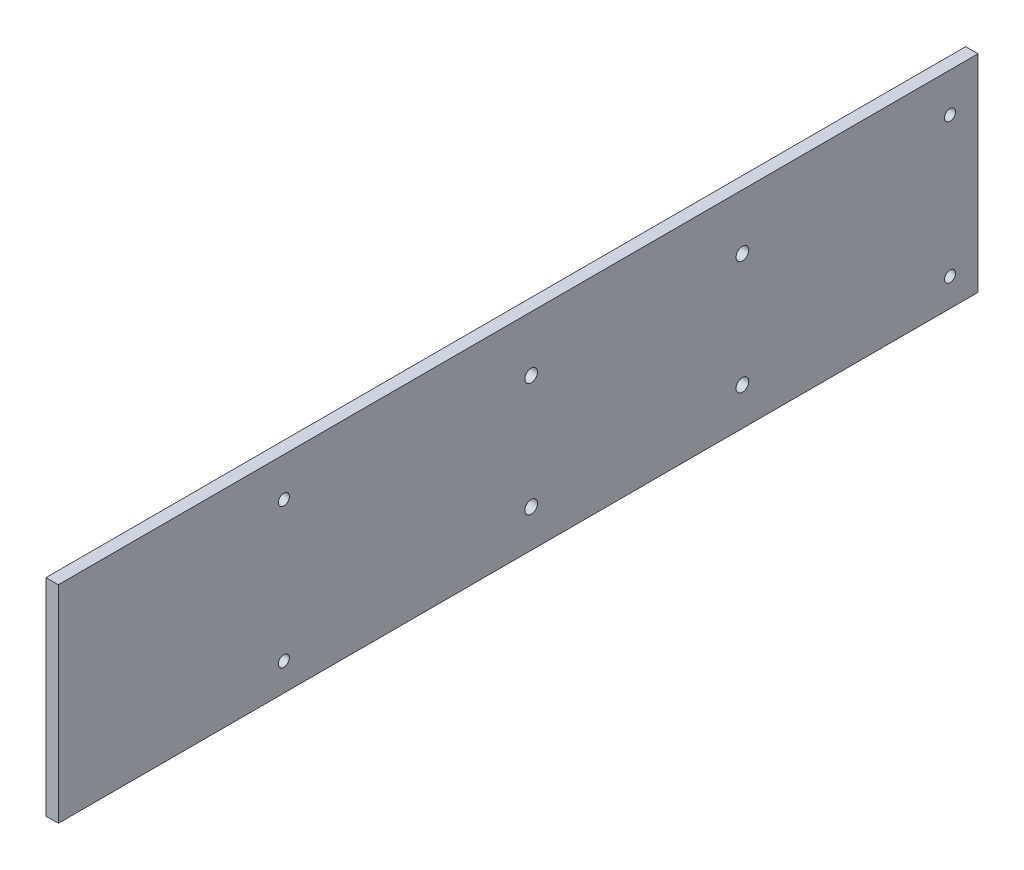
ISO-10303-21;
HEADER;
FILE_DESCRIPTION(('STEP AP214'),'2;1');
FILE_NAME('part.step','',(''),(''),'','','');
FILE_SCHEMA(('AUTOMOTIVE_DESIGN { 1 0 10303 214 1 1 1 1 }'));
ENDSEC;
DATA;
#1=APPLICATION_CONTEXT('core data for automotive mechanical design processes');
#2=APPLICATION_PROTOCOL_DEFINITION('international standard','automotive_design',2000,#1);
#3=PRODUCT_CONTEXT('',#1,'mechanical');
#4=PRODUCT('Part','Part','',(#3));
#5=PRODUCT_RELATED_PRODUCT_CATEGORY('part','',(#4));
#6=PRODUCT_DEFINITION_FORMATION('','',#4);
#7=PRODUCT_DEFINITION_CONTEXT('part definition',#1,'design');
#8=PRODUCT_DEFINITION('design','',#6,#7);
#9=PRODUCT_DEFINITION_SHAPE('','',#8);
#10=(LENGTH_UNIT() NAMED_UNIT(*) SI_UNIT(.MILLI.,.METRE.));
#11=(NAMED_UNIT(*) PLANE_ANGLE_UNIT() SI_UNIT($,.RADIAN.));
#12=(NAMED_UNIT(*) SI_UNIT($,.STERADIAN.) SOLID_ANGLE_UNIT());
#13=UNCERTAINTY_MEASURE_WITH_UNIT(LENGTH_MEASURE(1.E-05),#10,'distance_accuracy_value','');
#14=(GEOMETRIC_REPRESENTATION_CONTEXT(3) GLOBAL_UNCERTAINTY_ASSIGNED_CONTEXT((#13)) GLOBAL_UNIT_ASSIGNED_CONTEXT((#10,
#11,#12)) REPRESENTATION_CONTEXT('',''));
#15=CARTESIAN_POINT('',(0.,0.,0.));
#16=DIRECTION('',(0.,0.,1.));
#17=DIRECTION('',(1.,0.,0.));
#18=AXIS2_PLACEMENT_3D('',#15,#16,#17);
#19=CARTESIAN_POINT('',(4.826,38.1,-179.705));
#20=DIRECTION('',(0.,0.,1.));
#21=DIRECTION('',(1.,0.,0.));
#22=AXIS2_PLACEMENT_3D('',#19,#20,#21);
#23=PLANE('',#22);
#24=DIRECTION('',(0.,1.,0.));
#25=VECTOR('',#24,1.);
#26=CARTESIAN_POINT('',(0.,38.1,-179.705));
#27=LINE('',#26,#25);
#28=CARTESIAN_POINT('',(0.,-42.672,-179.705));
#29=VERTEX_POINT('',#28);
#30=CARTESIAN_POINT('',(0.,38.1,-179.705));
#31=VERTEX_POINT('',#30);
#32=EDGE_CURVE('E148',#29,#31,#27,.T.);
#33=ORIENTED_EDGE('',*,*,#32,.T.);
#34=DIRECTION('',(-1.,0.,0.));
#35=VECTOR('',#34,1.);
#36=CARTESIAN_POINT('',(4.826,38.1,-179.705));
#37=LINE('',#36,#35);
#38=CARTESIAN_POINT('',(4.826,38.1,-179.705));
#39=VERTEX_POINT('',#38);
#40=EDGE_CURVE('E11',#39,#31,#37,.T.);
#41=ORIENTED_EDGE('',*,*,#40,.F.);
#42=DIRECTION('',(0.,1.,0.));
#43=VECTOR('',#42,1.);
#44=CARTESIAN_POINT('',(4.826,38.1,-179.705));
#45=LINE('',#44,#43);
#46=CARTESIAN_POINT('',(4.82600000000004,-42.672,-179.705));
#47=VERTEX_POINT('',#46);
#48=EDGE_CURVE('E72',#47,#39,#45,.T.);
#49=ORIENTED_EDGE('',*,*,#48,.F.);
#50=DIRECTION('',(1.,0.,0.));
#51=VECTOR('',#50,1.);
#52=CARTESIAN_POINT('',(4.82600000000004,-42.672,-179.705));
#53=LINE('',#52,#51);
#54=EDGE_CURVE('E100',#29,#47,#53,.T.);
#55=ORIENTED_EDGE('',*,*,#54,.F.);
#56=EDGE_LOOP('',(#33,#41,#49,#55));
#57=FACE_BOUND('',#56,.T.);
#58=ADVANCED_FACE('F37',(#57),#23,.F.);
#59=CARTESIAN_POINT('',(4.826,38.1,179.705));
#60=DIRECTION('',(0.,-1.,0.));
#61=DIRECTION('',(0.,0.,-1.));
#62=AXIS2_PLACEMENT_3D('',#59,#60,#61);
#63=PLANE('',#62);
#64=DIRECTION('',(0.,0.,1.));
#65=VECTOR('',#64,1.);
#66=CARTESIAN_POINT('',(0.,38.1,179.705));
#67=LINE('',#66,#65);
#68=CARTESIAN_POINT('',(0.,38.1,179.705));
#69=VERTEX_POINT('',#68);
#70=EDGE_CURVE('E66',#31,#69,#67,.T.);
#71=ORIENTED_EDGE('',*,*,#70,.T.);
#72=DIRECTION('',(-1.,0.,0.));
#73=VECTOR('',#72,1.);
#74=CARTESIAN_POINT('',(4.826,38.1,179.705));
#75=LINE('',#74,#73);
#76=CARTESIAN_POINT('',(4.826,38.1,179.705));
#77=VERTEX_POINT('',#76);
#78=EDGE_CURVE('E46',#77,#69,#75,.T.);
#79=ORIENTED_EDGE('',*,*,#78,.F.);
#80=DIRECTION('',(0.,0.,1.));
#81=VECTOR('',#80,1.);
#82=CARTESIAN_POINT('',(4.826,38.1,179.705));
#83=LINE('',#82,#81);
#84=EDGE_CURVE('E55',#39,#77,#83,.T.);
#85=ORIENTED_EDGE('',*,*,#84,.F.);
#86=ORIENTED_EDGE('',*,*,#40,.T.);
#87=EDGE_LOOP('',(#71,#79,#85,#86));
#88=FACE_BOUND('',#87,.T.);
#89=ADVANCED_FACE('F178',(#88),#63,.F.);
#90=CARTESIAN_POINT('',(4.826,38.1,179.705));
#91=DIRECTION('',(0.,0.,-1.));
#92=DIRECTION('',(-1.,0.,0.));
#93=AXIS2_PLACEMENT_3D('',#90,#91,#92);
#94=PLANE('',#93);
#95=DIRECTION('',(0.,-1.,0.));
#96=VECTOR('',#95,1.);
#97=CARTESIAN_POINT('',(0.,38.1,179.705));
#98=LINE('',#97,#96);
#99=CARTESIAN_POINT('',(0.,-42.672,179.705));
#100=VERTEX_POINT('',#99);
#101=EDGE_CURVE('E93',#69,#100,#98,.T.);
#102=ORIENTED_EDGE('',*,*,#101,.T.);
#103=DIRECTION('',(-1.,0.,0.));
#104=VECTOR('',#103,1.);
#105=CARTESIAN_POINT('',(4.826,-42.672,179.705));
#106=LINE('',#105,#104);
#107=CARTESIAN_POINT('',(4.826,-42.672,179.705));
#108=VERTEX_POINT('',#107);
#109=EDGE_CURVE('E91',#108,#100,#106,.T.);
#110=ORIENTED_EDGE('',*,*,#109,.F.);
#111=DIRECTION('',(0.,-1.,0.));
#112=VECTOR('',#111,1.);
#113=CARTESIAN_POINT('',(4.826,38.1,179.705));
#114=LINE('',#113,#112);
#115=EDGE_CURVE('E82',#77,#108,#114,.T.);
#116=ORIENTED_EDGE('',*,*,#115,.F.);
#117=ORIENTED_EDGE('',*,*,#78,.T.);
#118=EDGE_LOOP('',(#102,#110,#116,#117));
#119=FACE_BOUND('',#118,.T.);
#120=ADVANCED_FACE('F92',(#119),#94,.F.);
#121=CARTESIAN_POINT('',(4.826,0.,0.));
#122=DIRECTION('',(1.,0.,0.));
#123=DIRECTION('',(0.,0.,-1.));
#124=AXIS2_PLACEMENT_3D('',#121,#122,#123);
#125=PLANE('',#124);
#126=CARTESIAN_POINT('',(4.826,22.86,91.5669999999999));
#127=DIRECTION('',(1.,0.,0.));
#128=DIRECTION('',(0.,0.,-1.));
#129=AXIS2_PLACEMENT_3D('',#126,#127,#128);
#130=CIRCLE('',#129,2.15265);
#131=CARTESIAN_POINT('',(4.826,22.86,89.4143499999999));
#132=VERTEX_POINT('',#131);
#133=EDGE_CURVE('E105',#132,#132,#130,.T.);
#134=ORIENTED_EDGE('',*,*,#133,.F.);
#135=EDGE_LOOP('',(#134));
#136=FACE_BOUND('',#135,.T.);
#137=CARTESIAN_POINT('',(4.826,-31.75,91.5669999999999));
#138=DIRECTION('',(1.,0.,0.));
#139=DIRECTION('',(0.,0.,-1.));
#140=AXIS2_PLACEMENT_3D('',#137,#138,#139);
#141=CIRCLE('',#140,2.15265);
#142=CARTESIAN_POINT('',(4.826,-31.75,89.4143499999999));
#143=VERTEX_POINT('',#142);
#144=EDGE_CURVE('E108',#143,#143,#141,.T.);
#145=ORIENTED_EDGE('',*,*,#144,.F.);
#146=EDGE_LOOP('',(#145));
#147=FACE_BOUND('',#146,.T.);
#148=CARTESIAN_POINT('',(4.826,-31.75,-168.783));
#149=DIRECTION('',(1.,0.,0.));
#150=DIRECTION('',(0.,0.,-1.));
#151=AXIS2_PLACEMENT_3D('',#148,#149,#150);
#152=CIRCLE('',#151,2.15265);
#153=CARTESIAN_POINT('',(4.826,-31.75,-170.93565));
#154=VERTEX_POINT('',#153);
#155=EDGE_CURVE('E114',#154,#154,#152,.T.);
#156=ORIENTED_EDGE('',*,*,#155,.F.);
#157=EDGE_LOOP('',(#156));
#158=FACE_BOUND('',#157,.T.);
#159=CARTESIAN_POINT('',(4.826,22.86,-168.783));
#160=DIRECTION('',(1.,0.,0.));
#161=DIRECTION('',(0.,0.,-1.));
#162=AXIS2_PLACEMENT_3D('',#159,#160,#161);
#163=CIRCLE('',#162,2.15265);
#164=CARTESIAN_POINT('',(4.826,22.86,-170.93565));
#165=VERTEX_POINT('',#164);
#166=EDGE_CURVE('E120',#165,#165,#163,.T.);
#167=ORIENTED_EDGE('',*,*,#166,.F.);
#168=EDGE_LOOP('',(#167));
#169=FACE_BOUND('',#168,.T.);
#170=CARTESIAN_POINT('',(4.826,-27.94,-87.63));
#171=DIRECTION('',(1.,0.,0.));
#172=DIRECTION('',(0.,0.,-1.));
#173=AXIS2_PLACEMENT_3D('',#170,#171,#172);
#174=CIRCLE('',#173,2.48919999999999);
#175=CARTESIAN_POINT('',(4.826,-27.94,-90.1192));
#176=VERTEX_POINT('',#175);
#177=EDGE_CURVE('E124',#176,#176,#174,.T.);
#178=ORIENTED_EDGE('',*,*,#177,.F.);
#179=EDGE_LOOP('',(#178));
#180=FACE_BOUND('',#179,.T.);
#181=CARTESIAN_POINT('',(4.826,-27.94,-5.08000000000003));
#182=DIRECTION('',(1.,0.,0.));
#183=DIRECTION('',(0.,0.,-1.));
#184=AXIS2_PLACEMENT_3D('',#181,#182,#183);
#185=CIRCLE('',#184,2.48919999999999);
#186=CARTESIAN_POINT('',(4.826,-27.94,-7.56920000000002));
#187=VERTEX_POINT('',#186);
#188=EDGE_CURVE('E130',#187,#187,#185,.T.);
#189=ORIENTED_EDGE('',*,*,#188,.F.);
#190=EDGE_LOOP('',(#189));
#191=FACE_BOUND('',#190,.T.);
#192=CARTESIAN_POINT('',(4.826,16.51,-5.08000000000003));
#193=DIRECTION('',(1.,0.,0.));
#194=DIRECTION('',(0.,0.,-1.));
#195=AXIS2_PLACEMENT_3D('',#192,#193,#194);
#196=CIRCLE('',#195,2.48919999999999);
#197=CARTESIAN_POINT('',(4.826,16.51,-7.56920000000002));
#198=VERTEX_POINT('',#197);
#199=EDGE_CURVE('E136',#198,#198,#196,.T.);
#200=ORIENTED_EDGE('',*,*,#199,.F.);
#201=EDGE_LOOP('',(#200));
#202=FACE_BOUND('',#201,.T.);
#203=CARTESIAN_POINT('',(4.826,16.51,-87.63));
#204=DIRECTION('',(1.,0.,0.));
#205=DIRECTION('',(0.,0.,-1.));
#206=AXIS2_PLACEMENT_3D('',#203,#204,#205);
#207=CIRCLE('',#206,2.48919999999999);
#208=CARTESIAN_POINT('',(4.826,16.51,-90.1192));
#209=VERTEX_POINT('',#208);
#210=EDGE_CURVE('E142',#209,#209,#207,.T.);
#211=ORIENTED_EDGE('',*,*,#210,.F.);
#212=EDGE_LOOP('',(#211));
#213=FACE_BOUND('',#212,.T.);
#214=ORIENTED_EDGE('',*,*,#48,.T.);
#215=ORIENTED_EDGE('',*,*,#84,.T.);
#216=ORIENTED_EDGE('',*,*,#115,.T.);
#217=DIRECTION('',(0.,0.,1.));
#218=VECTOR('',#217,1.);
#219=CARTESIAN_POINT('',(4.826,-42.672,179.705));
#220=LINE('',#219,#218);
#221=EDGE_CURVE('E86',#47,#108,#220,.T.);
#222=ORIENTED_EDGE('',*,*,#221,.F.);
#223=EDGE_LOOP('',(#214,#215,#216,#222));
#224=FACE_BOUND('',#223,.T.);
#225=ADVANCED_FACE('F84',(#136,#147,#158,#169,#180,#191,#202,#213,#224),#125,.T.);
#226=CARTESIAN_POINT('',(0.,0.,0.));
#227=DIRECTION('',(1.,0.,0.));
#228=DIRECTION('',(0.,0.,-1.));
#229=AXIS2_PLACEMENT_3D('',#226,#227,#228);
#230=PLANE('',#229);
#231=CARTESIAN_POINT('',(0.,22.86,91.5669999999999));
#232=DIRECTION('',(1.,0.,0.));
#233=DIRECTION('',(0.,0.,-1.));
#234=AXIS2_PLACEMENT_3D('',#231,#232,#233);
#235=CIRCLE('',#234,2.15265);
#236=CARTESIAN_POINT('',(0.,22.86,89.4143499999999));
#237=VERTEX_POINT('',#236);
#238=EDGE_CURVE('E40',#237,#237,#235,.T.);
#239=ORIENTED_EDGE('',*,*,#238,.T.);
#240=EDGE_LOOP('',(#239));
#241=FACE_BOUND('',#240,.T.);
#242=CARTESIAN_POINT('',(0.,-31.75,91.5669999999999));
#243=DIRECTION('',(1.,0.,0.));
#244=DIRECTION('',(0.,0.,-1.));
#245=AXIS2_PLACEMENT_3D('',#242,#243,#244);
#246=CIRCLE('',#245,2.15265);
#247=CARTESIAN_POINT('',(0.,-31.75,89.4143499999999));
#248=VERTEX_POINT('',#247);
#249=EDGE_CURVE('E111',#248,#248,#246,.T.);
#250=ORIENTED_EDGE('',*,*,#249,.T.);
#251=EDGE_LOOP('',(#250));
#252=FACE_BOUND('',#251,.T.);
#253=CARTESIAN_POINT('',(0.,-31.75,-168.783));
#254=DIRECTION('',(1.,0.,0.));
#255=DIRECTION('',(0.,0.,-1.));
#256=AXIS2_PLACEMENT_3D('',#253,#254,#255);
#257=CIRCLE('',#256,2.15265);
#258=CARTESIAN_POINT('',(0.,-31.75,-170.93565));
#259=VERTEX_POINT('',#258);
#260=EDGE_CURVE('E117',#259,#259,#257,.T.);
#261=ORIENTED_EDGE('',*,*,#260,.T.);
#262=EDGE_LOOP('',(#261));
#263=FACE_BOUND('',#262,.T.);
#264=CARTESIAN_POINT('',(0.,22.86,-168.783));
#265=DIRECTION('',(1.,0.,0.));
#266=DIRECTION('',(0.,0.,-1.));
#267=AXIS2_PLACEMENT_3D('',#264,#265,#266);
#268=CIRCLE('',#267,2.15265);
#269=CARTESIAN_POINT('',(0.,22.86,-170.93565));
#270=VERTEX_POINT('',#269);
#271=EDGE_CURVE('E123',#270,#270,#268,.T.);
#272=ORIENTED_EDGE('',*,*,#271,.T.);
#273=EDGE_LOOP('',(#272));
#274=FACE_BOUND('',#273,.T.);
#275=CARTESIAN_POINT('',(0.,-27.94,-87.63));
#276=DIRECTION('',(1.,0.,0.));
#277=DIRECTION('',(0.,0.,-1.));
#278=AXIS2_PLACEMENT_3D('',#275,#276,#277);
#279=CIRCLE('',#278,2.4892);
#280=CARTESIAN_POINT('',(0.,-27.94,-90.1192));
#281=VERTEX_POINT('',#280);
#282=EDGE_CURVE('E127',#281,#281,#279,.T.);
#283=ORIENTED_EDGE('',*,*,#282,.T.);
#284=EDGE_LOOP('',(#283));
#285=FACE_BOUND('',#284,.T.);
#286=CARTESIAN_POINT('',(0.,-27.94,-5.08000000000003));
#287=DIRECTION('',(1.,0.,0.));
#288=DIRECTION('',(0.,0.,-1.));
#289=AXIS2_PLACEMENT_3D('',#286,#287,#288);
#290=CIRCLE('',#289,2.4892);
#291=CARTESIAN_POINT('',(0.,-27.94,-7.56920000000003));
#292=VERTEX_POINT('',#291);
#293=EDGE_CURVE('E133',#292,#292,#290,.T.);
#294=ORIENTED_EDGE('',*,*,#293,.T.);
#295=EDGE_LOOP('',(#294));
#296=FACE_BOUND('',#295,.T.);
#297=CARTESIAN_POINT('',(0.,16.51,-5.08000000000003));
#298=DIRECTION('',(1.,0.,0.));
#299=DIRECTION('',(0.,0.,-1.));
#300=AXIS2_PLACEMENT_3D('',#297,#298,#299);
#301=CIRCLE('',#300,2.4892);
#302=CARTESIAN_POINT('',(0.,16.51,-7.56920000000003));
#303=VERTEX_POINT('',#302);
#304=EDGE_CURVE('E139',#303,#303,#301,.T.);
#305=ORIENTED_EDGE('',*,*,#304,.T.);
#306=EDGE_LOOP('',(#305));
#307=FACE_BOUND('',#306,.T.);
#308=CARTESIAN_POINT('',(0.,16.51,-87.63));
#309=DIRECTION('',(1.,0.,0.));
#310=DIRECTION('',(0.,0.,-1.));
#311=AXIS2_PLACEMENT_3D('',#308,#309,#310);
#312=CIRCLE('',#311,2.4892);
#313=CARTESIAN_POINT('',(0.,16.51,-90.1192));
#314=VERTEX_POINT('',#313);
#315=EDGE_CURVE('E145',#314,#314,#312,.T.);
#316=ORIENTED_EDGE('',*,*,#315,.T.);
#317=EDGE_LOOP('',(#316));
#318=FACE_BOUND('',#317,.T.);
#319=ORIENTED_EDGE('',*,*,#32,.F.);
#320=DIRECTION('',(0.,0.,-1.));
#321=VECTOR('',#320,1.);
#322=CARTESIAN_POINT('',(0.,-42.672,179.705));
#323=LINE('',#322,#321);
#324=EDGE_CURVE('E97',#100,#29,#323,.T.);
#325=ORIENTED_EDGE('',*,*,#324,.F.);
#326=ORIENTED_EDGE('',*,*,#101,.F.);
#327=ORIENTED_EDGE('',*,*,#70,.F.);
#328=EDGE_LOOP('',(#319,#325,#326,#327));
#329=FACE_BOUND('',#328,.T.);
#330=ADVANCED_FACE('F158',(#241,#252,#263,#274,#285,#296,#307,#318,#329),#230,.F.);
#331=CARTESIAN_POINT('',(4.826,16.51,-87.63));
#332=DIRECTION('',(1.,0.,0.));
#333=DIRECTION('',(0.,0.,-1.));
#334=AXIS2_PLACEMENT_3D('',#331,#332,#333);
#335=CYLINDRICAL_SURFACE('',#334,2.48919999999999);
#336=ORIENTED_EDGE('',*,*,#315,.F.);
#337=EDGE_LOOP('',(#336));
#338=FACE_BOUND('',#337,.T.);
#339=ORIENTED_EDGE('',*,*,#210,.T.);
#340=EDGE_LOOP('',(#339));
#341=FACE_BOUND('',#340,.T.);
#342=ADVANCED_FACE('F184',(#338,#341),#335,.F.);
#343=CARTESIAN_POINT('',(4.826,16.51,-5.08000000000003));
#344=DIRECTION('',(1.,0.,0.));
#345=DIRECTION('',(0.,0.,-1.));
#346=AXIS2_PLACEMENT_3D('',#343,#344,#345);
#347=CYLINDRICAL_SURFACE('',#346,2.48919999999999);
#348=ORIENTED_EDGE('',*,*,#304,.F.);
#349=EDGE_LOOP('',(#348));
#350=FACE_BOUND('',#349,.T.);
#351=ORIENTED_EDGE('',*,*,#199,.T.);
#352=EDGE_LOOP('',(#351));
#353=FACE_BOUND('',#352,.T.);
#354=ADVANCED_FACE('F191',(#350,#353),#347,.F.);
#355=CARTESIAN_POINT('',(4.826,-27.94,-5.08000000000003));
#356=DIRECTION('',(1.,0.,0.));
#357=DIRECTION('',(0.,0.,-1.));
#358=AXIS2_PLACEMENT_3D('',#355,#356,#357);
#359=CYLINDRICAL_SURFACE('',#358,2.48919999999999);
#360=ORIENTED_EDGE('',*,*,#293,.F.);
#361=EDGE_LOOP('',(#360));
#362=FACE_BOUND('',#361,.T.);
#363=ORIENTED_EDGE('',*,*,#188,.T.);
#364=EDGE_LOOP('',(#363));
#365=FACE_BOUND('',#364,.T.);
#366=ADVANCED_FACE('F174',(#362,#365),#359,.F.);
#367=CARTESIAN_POINT('',(4.826,-27.94,-87.63));
#368=DIRECTION('',(1.,0.,0.));
#369=DIRECTION('',(0.,0.,-1.));
#370=AXIS2_PLACEMENT_3D('',#367,#368,#369);
#371=CYLINDRICAL_SURFACE('',#370,2.48919999999999);
#372=ORIENTED_EDGE('',*,*,#282,.F.);
#373=EDGE_LOOP('',(#372));
#374=FACE_BOUND('',#373,.T.);
#375=ORIENTED_EDGE('',*,*,#177,.T.);
#376=EDGE_LOOP('',(#375));
#377=FACE_BOUND('',#376,.T.);
#378=ADVANCED_FACE('F164',(#374,#377),#371,.F.);
#379=CARTESIAN_POINT('',(4.826,22.86,-168.783));
#380=DIRECTION('',(1.,0.,0.));
#381=DIRECTION('',(0.,0.,-1.));
#382=AXIS2_PLACEMENT_3D('',#379,#380,#381);
#383=CYLINDRICAL_SURFACE('',#382,2.15265);
#384=ORIENTED_EDGE('',*,*,#166,.T.);
#385=EDGE_LOOP('',(#384));
#386=FACE_BOUND('',#385,.T.);
#387=ORIENTED_EDGE('',*,*,#271,.F.);
#388=EDGE_LOOP('',(#387));
#389=FACE_BOUND('',#388,.T.);
#390=ADVANCED_FACE('F161',(#386,#389),#383,.F.);
#391=CARTESIAN_POINT('',(4.826,-31.75,-168.783));
#392=DIRECTION('',(1.,0.,0.));
#393=DIRECTION('',(0.,0.,-1.));
#394=AXIS2_PLACEMENT_3D('',#391,#392,#393);
#395=CYLINDRICAL_SURFACE('',#394,2.15265);
#396=ORIENTED_EDGE('',*,*,#155,.T.);
#397=EDGE_LOOP('',(#396));
#398=FACE_BOUND('',#397,.T.);
#399=ORIENTED_EDGE('',*,*,#260,.F.);
#400=EDGE_LOOP('',(#399));
#401=FACE_BOUND('',#400,.T.);
#402=ADVANCED_FACE('F163',(#398,#401),#395,.F.);
#403=CARTESIAN_POINT('',(4.826,-31.75,91.5669999999999));
#404=DIRECTION('',(1.,0.,0.));
#405=DIRECTION('',(0.,0.,-1.));
#406=AXIS2_PLACEMENT_3D('',#403,#404,#405);
#407=CYLINDRICAL_SURFACE('',#406,2.15265);
#408=ORIENTED_EDGE('',*,*,#144,.T.);
#409=EDGE_LOOP('',(#408));
#410=FACE_BOUND('',#409,.T.);
#411=ORIENTED_EDGE('',*,*,#249,.F.);
#412=EDGE_LOOP('',(#411));
#413=FACE_BOUND('',#412,.T.);
#414=ADVANCED_FACE('F171',(#410,#413),#407,.F.);
#415=CARTESIAN_POINT('',(4.826,22.86,91.5669999999999));
#416=DIRECTION('',(1.,0.,0.));
#417=DIRECTION('',(0.,0.,-1.));
#418=AXIS2_PLACEMENT_3D('',#415,#416,#417);
#419=CYLINDRICAL_SURFACE('',#418,2.15265);
#420=ORIENTED_EDGE('',*,*,#133,.T.);
#421=EDGE_LOOP('',(#420));
#422=FACE_BOUND('',#421,.T.);
#423=ORIENTED_EDGE('',*,*,#238,.F.);
#424=EDGE_LOOP('',(#423));
#425=FACE_BOUND('',#424,.T.);
#426=ADVANCED_FACE('F222',(#422,#425),#419,.F.);
#427=CARTESIAN_POINT('',(0.,-42.672,0.));
#428=DIRECTION('',(0.,1.,0.));
#429=DIRECTION('',(0.,0.,1.));
#430=AXIS2_PLACEMENT_3D('',#427,#428,#429);
#431=PLANE('',#430);
#432=ORIENTED_EDGE('',*,*,#221,.T.);
#433=ORIENTED_EDGE('',*,*,#109,.T.);
#434=ORIENTED_EDGE('',*,*,#324,.T.);
#435=ORIENTED_EDGE('',*,*,#54,.T.);
#436=EDGE_LOOP('',(#432,#433,#434,#435));
#437=FACE_BOUND('',#436,.T.);
#438=ADVANCED_FACE('F99',(#437),#431,.F.);
#439=CLOSED_SHELL('',(#58,#89,#120,#225,#330,#342,#354,#366,#378,#390,#402,#414,#426,#438));
#440=MANIFOLD_SOLID_BREP('B2',#439);
#441=ADVANCED_BREP_SHAPE_REPRESENTATION('',(#18,#440),#14);
#442=SHAPE_DEFINITION_REPRESENTATION(#9,#441);
ENDSEC;
END-ISO-10303-21;
